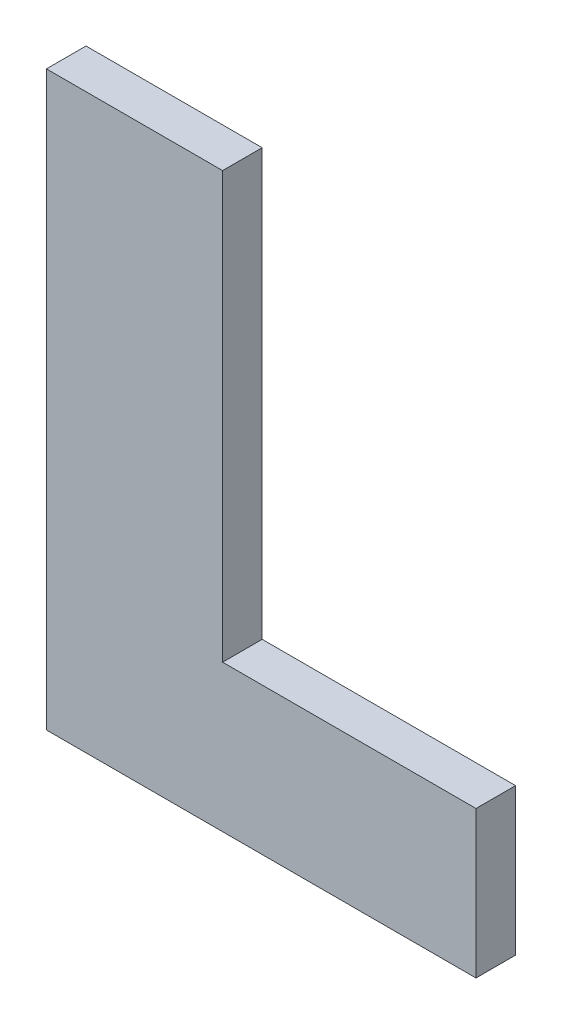
ISO-10303-21;
HEADER;
FILE_DESCRIPTION(('STEP AP214'),'2;1');
FILE_NAME('part.step','',(''),(''),'','','');
FILE_SCHEMA(('AUTOMOTIVE_DESIGN { 1 0 10303 214 1 1 1 1 }'));
ENDSEC;
DATA;
#1=APPLICATION_CONTEXT('core data for automotive mechanical design processes');
#2=APPLICATION_PROTOCOL_DEFINITION('international standard','automotive_design',2000,#1);
#3=PRODUCT_CONTEXT('',#1,'mechanical');
#4=PRODUCT('Part','Part','',(#3));
#5=PRODUCT_RELATED_PRODUCT_CATEGORY('part','',(#4));
#6=PRODUCT_DEFINITION_FORMATION('','',#4);
#7=PRODUCT_DEFINITION_CONTEXT('part definition',#1,'design');
#8=PRODUCT_DEFINITION('design','',#6,#7);
#9=PRODUCT_DEFINITION_SHAPE('','',#8);
#10=(LENGTH_UNIT() NAMED_UNIT(*) SI_UNIT(.MILLI.,.METRE.));
#11=(NAMED_UNIT(*) PLANE_ANGLE_UNIT() SI_UNIT($,.RADIAN.));
#12=(NAMED_UNIT(*) SI_UNIT($,.STERADIAN.) SOLID_ANGLE_UNIT());
#13=UNCERTAINTY_MEASURE_WITH_UNIT(LENGTH_MEASURE(1.E-05),#10,'distance_accuracy_value','');
#14=(GEOMETRIC_REPRESENTATION_CONTEXT(3) GLOBAL_UNCERTAINTY_ASSIGNED_CONTEXT((#13)) GLOBAL_UNIT_ASSIGNED_CONTEXT((#10,
#11,#12)) REPRESENTATION_CONTEXT('',''));
#15=CARTESIAN_POINT('',(0.,0.,0.));
#16=DIRECTION('',(0.,0.,1.));
#17=DIRECTION('',(1.,0.,0.));
#18=AXIS2_PLACEMENT_3D('',#15,#16,#17);
#19=CARTESIAN_POINT('',(0.,0.,0.05));
#20=DIRECTION('',(0.,0.,1.));
#21=DIRECTION('',(1.,0.,0.));
#22=AXIS2_PLACEMENT_3D('',#19,#20,#21);
#23=PLANE('',#22);
#24=DIRECTION('',(1.,0.,0.));
#25=VECTOR('',#24,1.);
#26=CARTESIAN_POINT('',(4.551172,0.839978,0.05));
#27=LINE('',#26,#25);
#28=CARTESIAN_POINT('',(4.231132,0.839978,0.05));
#29=VERTEX_POINT('',#28);
#30=CARTESIAN_POINT('',(4.551172,0.839978,0.05));
#31=VERTEX_POINT('',#30);
#32=EDGE_CURVE('E82',#29,#31,#27,.T.);
#33=ORIENTED_EDGE('',*,*,#32,.F.);
#34=DIRECTION('',(0.,1.,0.));
#35=VECTOR('',#34,1.);
#36=CARTESIAN_POINT('',(4.231132,0.839978,0.05));
#37=LINE('',#36,#35);
#38=CARTESIAN_POINT('',(4.231132,1.377696,0.05));
#39=VERTEX_POINT('',#38);
#40=EDGE_CURVE('E20',#39,#29,#37,.F.);
#41=ORIENTED_EDGE('',*,*,#40,.F.);
#42=DIRECTION('',(1.,0.,0.));
#43=VECTOR('',#42,1.);
#44=CARTESIAN_POINT('',(4.231132,1.377696,0.05));
#45=LINE('',#44,#43);
#46=CARTESIAN_POINT('',(4.008628,1.377696,0.05));
#47=VERTEX_POINT('',#46);
#48=EDGE_CURVE('E71',#47,#39,#45,.T.);
#49=ORIENTED_EDGE('',*,*,#48,.F.);
#50=DIRECTION('',(0.,1.,0.));
#51=VECTOR('',#50,1.);
#52=CARTESIAN_POINT('',(4.008628,1.377696,0.05));
#53=LINE('',#52,#51);
#54=CARTESIAN_POINT('',(4.008628,0.654558,0.05));
#55=VERTEX_POINT('',#54);
#56=EDGE_CURVE('E66',#55,#47,#53,.T.);
#57=ORIENTED_EDGE('',*,*,#56,.F.);
#58=DIRECTION('',(1.,0.,0.));
#59=VECTOR('',#58,1.);
#60=CARTESIAN_POINT('',(4.008628,0.654558,0.05));
#61=LINE('',#60,#59);
#62=CARTESIAN_POINT('',(4.551172,0.654558,0.05));
#63=VERTEX_POINT('',#62);
#64=EDGE_CURVE('E93',#63,#55,#61,.F.);
#65=ORIENTED_EDGE('',*,*,#64,.F.);
#66=DIRECTION('',(0.,1.,0.));
#67=VECTOR('',#66,1.);
#68=CARTESIAN_POINT('',(4.551172,0.654558,0.05));
#69=LINE('',#68,#67);
#70=EDGE_CURVE('E97',#31,#63,#69,.F.);
#71=ORIENTED_EDGE('',*,*,#70,.F.);
#72=EDGE_LOOP('',(#33,#41,#49,#57,#65,#71));
#73=FACE_BOUND('',#72,.T.);
#74=ADVANCED_FACE('F17',(#73),#23,.T.);
#75=CARTESIAN_POINT('',(4.231132,0.839978,0.));
#76=DIRECTION('',(1.,0.,0.));
#77=DIRECTION('',(0.,0.,-1.));
#78=AXIS2_PLACEMENT_3D('',#75,#76,#77);
#79=PLANE('',#78);
#80=DIRECTION('',(0.,0.,1.));
#81=VECTOR('',#80,1.);
#82=CARTESIAN_POINT('',(4.231132,0.839978,0.));
#83=LINE('',#82,#81);
#84=CARTESIAN_POINT('',(4.231132,0.839978,0.));
#85=VERTEX_POINT('',#84);
#86=EDGE_CURVE('E101',#85,#29,#83,.T.);
#87=ORIENTED_EDGE('',*,*,#86,.F.);
#88=DIRECTION('',(0.,1.,0.));
#89=VECTOR('',#88,1.);
#90=CARTESIAN_POINT('',(4.231132,0.,0.));
#91=LINE('',#90,#89);
#92=CARTESIAN_POINT('',(4.231132,1.377696,0.));
#93=VERTEX_POINT('',#92);
#94=EDGE_CURVE('E88',#85,#93,#91,.T.);
#95=ORIENTED_EDGE('',*,*,#94,.T.);
#96=DIRECTION('',(0.,0.,1.));
#97=VECTOR('',#96,1.);
#98=CARTESIAN_POINT('',(4.231132,1.377696,0.));
#99=LINE('',#98,#97);
#100=EDGE_CURVE('E76',#39,#93,#99,.F.);
#101=ORIENTED_EDGE('',*,*,#100,.F.);
#102=ORIENTED_EDGE('',*,*,#40,.T.);
#103=EDGE_LOOP('',(#87,#95,#101,#102));
#104=FACE_BOUND('',#103,.T.);
#105=ADVANCED_FACE('F87',(#104),#79,.T.);
#106=CARTESIAN_POINT('',(4.231132,1.377696,0.));
#107=DIRECTION('',(0.,1.,0.));
#108=DIRECTION('',(0.,0.,1.));
#109=AXIS2_PLACEMENT_3D('',#106,#107,#108);
#110=PLANE('',#109);
#111=ORIENTED_EDGE('',*,*,#100,.T.);
#112=DIRECTION('',(1.,0.,0.));
#113=VECTOR('',#112,1.);
#114=CARTESIAN_POINT('',(0.,1.377696,0.));
#115=LINE('',#114,#113);
#116=CARTESIAN_POINT('',(4.008628,1.377696,0.));
#117=VERTEX_POINT('',#116);
#118=EDGE_CURVE('E106',#93,#117,#115,.F.);
#119=ORIENTED_EDGE('',*,*,#118,.T.);
#120=DIRECTION('',(0.,0.,1.));
#121=VECTOR('',#120,1.);
#122=CARTESIAN_POINT('',(4.008628,1.377696,0.));
#123=LINE('',#122,#121);
#124=EDGE_CURVE('E78',#47,#117,#123,.F.);
#125=ORIENTED_EDGE('',*,*,#124,.F.);
#126=ORIENTED_EDGE('',*,*,#48,.T.);
#127=EDGE_LOOP('',(#111,#119,#125,#126));
#128=FACE_BOUND('',#127,.T.);
#129=ADVANCED_FACE('F73',(#128),#110,.T.);
#130=CARTESIAN_POINT('',(4.008628,1.377696,0.));
#131=DIRECTION('',(-1.,0.,0.));
#132=DIRECTION('',(0.,0.,1.));
#133=AXIS2_PLACEMENT_3D('',#130,#131,#132);
#134=PLANE('',#133);
#135=ORIENTED_EDGE('',*,*,#124,.T.);
#136=DIRECTION('',(0.,1.,0.));
#137=VECTOR('',#136,1.);
#138=CARTESIAN_POINT('',(4.008628,0.,0.));
#139=LINE('',#138,#137);
#140=CARTESIAN_POINT('',(4.008628,0.654558,0.));
#141=VERTEX_POINT('',#140);
#142=EDGE_CURVE('E108',#117,#141,#139,.F.);
#143=ORIENTED_EDGE('',*,*,#142,.T.);
#144=DIRECTION('',(0.,0.,-1.));
#145=VECTOR('',#144,1.);
#146=CARTESIAN_POINT('',(4.008628,0.654558,0.));
#147=LINE('',#146,#145);
#148=EDGE_CURVE('E95',#55,#141,#147,.T.);
#149=ORIENTED_EDGE('',*,*,#148,.F.);
#150=ORIENTED_EDGE('',*,*,#56,.T.);
#151=EDGE_LOOP('',(#135,#143,#149,#150));
#152=FACE_BOUND('',#151,.T.);
#153=ADVANCED_FACE('F126',(#152),#134,.T.);
#154=CARTESIAN_POINT('',(4.008628,0.654558,0.));
#155=DIRECTION('',(0.,-1.,0.));
#156=DIRECTION('',(0.,0.,-1.));
#157=AXIS2_PLACEMENT_3D('',#154,#155,#156);
#158=PLANE('',#157);
#159=ORIENTED_EDGE('',*,*,#148,.T.);
#160=DIRECTION('',(1.,0.,0.));
#161=VECTOR('',#160,1.);
#162=CARTESIAN_POINT('',(0.,0.654558,0.));
#163=LINE('',#162,#161);
#164=CARTESIAN_POINT('',(4.551172,0.654558,0.));
#165=VERTEX_POINT('',#164);
#166=EDGE_CURVE('E111',#141,#165,#163,.T.);
#167=ORIENTED_EDGE('',*,*,#166,.T.);
#168=DIRECTION('',(0.,0.,-1.));
#169=VECTOR('',#168,1.);
#170=CARTESIAN_POINT('',(4.551172,0.654558,0.));
#171=LINE('',#170,#169);
#172=EDGE_CURVE('E99',#63,#165,#171,.T.);
#173=ORIENTED_EDGE('',*,*,#172,.F.);
#174=ORIENTED_EDGE('',*,*,#64,.T.);
#175=EDGE_LOOP('',(#159,#167,#173,#174));
#176=FACE_BOUND('',#175,.T.);
#177=ADVANCED_FACE('F124',(#176),#158,.T.);
#178=CARTESIAN_POINT('',(4.551172,0.654558,0.));
#179=DIRECTION('',(1.,0.,0.));
#180=DIRECTION('',(0.,0.,-1.));
#181=AXIS2_PLACEMENT_3D('',#178,#179,#180);
#182=PLANE('',#181);
#183=ORIENTED_EDGE('',*,*,#172,.T.);
#184=DIRECTION('',(0.,1.,0.));
#185=VECTOR('',#184,1.);
#186=CARTESIAN_POINT('',(4.551172,0.,0.));
#187=LINE('',#186,#185);
#188=CARTESIAN_POINT('',(4.551172,0.839978,0.));
#189=VERTEX_POINT('',#188);
#190=EDGE_CURVE('E26',#165,#189,#187,.T.);
#191=ORIENTED_EDGE('',*,*,#190,.T.);
#192=DIRECTION('',(0.,0.,1.));
#193=VECTOR('',#192,1.);
#194=CARTESIAN_POINT('',(4.551172,0.839978,0.));
#195=LINE('',#194,#193);
#196=EDGE_CURVE('E34',#31,#189,#195,.F.);
#197=ORIENTED_EDGE('',*,*,#196,.F.);
#198=ORIENTED_EDGE('',*,*,#70,.T.);
#199=EDGE_LOOP('',(#183,#191,#197,#198));
#200=FACE_BOUND('',#199,.T.);
#201=ADVANCED_FACE('F117',(#200),#182,.T.);
#202=CARTESIAN_POINT('',(4.551172,0.839978,0.));
#203=DIRECTION('',(0.,1.,0.));
#204=DIRECTION('',(0.,0.,1.));
#205=AXIS2_PLACEMENT_3D('',#202,#203,#204);
#206=PLANE('',#205);
#207=ORIENTED_EDGE('',*,*,#196,.T.);
#208=DIRECTION('',(1.,0.,0.));
#209=VECTOR('',#208,1.);
#210=CARTESIAN_POINT('',(0.,0.839978,0.));
#211=LINE('',#210,#209);
#212=EDGE_CURVE('E11',#189,#85,#211,.F.);
#213=ORIENTED_EDGE('',*,*,#212,.T.);
#214=ORIENTED_EDGE('',*,*,#86,.T.);
#215=ORIENTED_EDGE('',*,*,#32,.T.);
#216=EDGE_LOOP('',(#207,#213,#214,#215));
#217=FACE_BOUND('',#216,.T.);
#218=ADVANCED_FACE('F127',(#217),#206,.T.);
#219=CARTESIAN_POINT('',(0.,0.,0.));
#220=DIRECTION('',(0.,0.,1.));
#221=DIRECTION('',(1.,0.,0.));
#222=AXIS2_PLACEMENT_3D('',#219,#220,#221);
#223=PLANE('',#222);
#224=ORIENTED_EDGE('',*,*,#190,.F.);
#225=ORIENTED_EDGE('',*,*,#166,.F.);
#226=ORIENTED_EDGE('',*,*,#142,.F.);
#227=ORIENTED_EDGE('',*,*,#118,.F.);
#228=ORIENTED_EDGE('',*,*,#94,.F.);
#229=ORIENTED_EDGE('',*,*,#212,.F.);
#230=EDGE_LOOP('',(#224,#225,#226,#227,#228,#229));
#231=FACE_BOUND('',#230,.T.);
#232=ADVANCED_FACE('F121',(#231),#223,.F.);
#233=CLOSED_SHELL('',(#74,#105,#129,#153,#177,#201,#218,#232));
#234=MANIFOLD_SOLID_BREP('B1',#233);
#235=ADVANCED_BREP_SHAPE_REPRESENTATION('',(#18,#234),#14);
#236=SHAPE_DEFINITION_REPRESENTATION(#9,#235);
ENDSEC;
END-ISO-10303-21;
